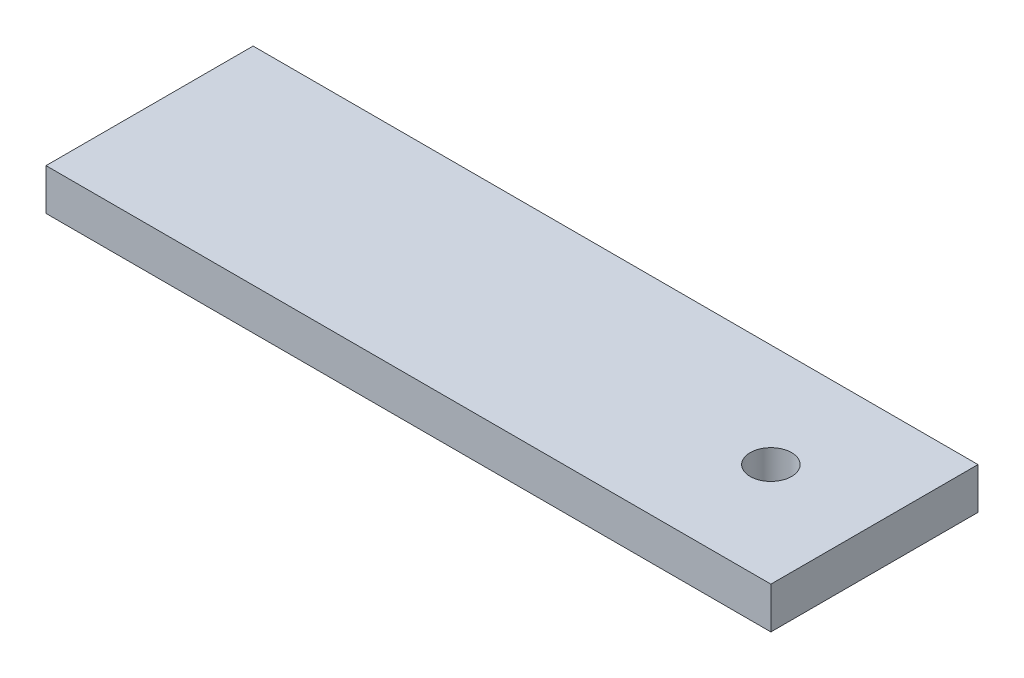
ISO-10303-21;
HEADER;
FILE_DESCRIPTION(('STEP AP214'),'2;1');
FILE_NAME('part.step','',(''),(''),'','','');
FILE_SCHEMA(('AUTOMOTIVE_DESIGN { 1 0 10303 214 1 1 1 1 }'));
ENDSEC;
DATA;
#1=APPLICATION_CONTEXT('core data for automotive mechanical design processes');
#2=APPLICATION_PROTOCOL_DEFINITION('international standard','automotive_design',2000,#1);
#3=PRODUCT_CONTEXT('',#1,'mechanical');
#4=PRODUCT('Part','Part','',(#3));
#5=PRODUCT_RELATED_PRODUCT_CATEGORY('part','',(#4));
#6=PRODUCT_DEFINITION_FORMATION('','',#4);
#7=PRODUCT_DEFINITION_CONTEXT('part definition',#1,'design');
#8=PRODUCT_DEFINITION('design','',#6,#7);
#9=PRODUCT_DEFINITION_SHAPE('','',#8);
#10=(LENGTH_UNIT() NAMED_UNIT(*) SI_UNIT(.MILLI.,.METRE.));
#11=(NAMED_UNIT(*) PLANE_ANGLE_UNIT() SI_UNIT($,.RADIAN.));
#12=(NAMED_UNIT(*) SI_UNIT($,.STERADIAN.) SOLID_ANGLE_UNIT());
#13=UNCERTAINTY_MEASURE_WITH_UNIT(LENGTH_MEASURE(1.E-05),#10,'distance_accuracy_value','');
#14=(GEOMETRIC_REPRESENTATION_CONTEXT(3) GLOBAL_UNCERTAINTY_ASSIGNED_CONTEXT((#13)) GLOBAL_UNIT_ASSIGNED_CONTEXT((#10,
#11,#12)) REPRESENTATION_CONTEXT('',''));
#15=CARTESIAN_POINT('',(0.,0.,0.));
#16=DIRECTION('',(0.,0.,1.));
#17=DIRECTION('',(1.,0.,0.));
#18=AXIS2_PLACEMENT_3D('',#15,#16,#17);
#19=CARTESIAN_POINT('',(0.,4.,0.));
#20=DIRECTION('',(1.,0.,0.));
#21=DIRECTION('',(0.,0.,-1.));
#22=AXIS2_PLACEMENT_3D('',#19,#20,#21);
#23=PLANE('',#22);
#24=DIRECTION('',(0.,0.,1.));
#25=VECTOR('',#24,1.);
#26=CARTESIAN_POINT('',(0.,0.,0.));
#27=LINE('',#26,#25);
#28=CARTESIAN_POINT('',(0.,0.,-20.));
#29=VERTEX_POINT('',#28);
#30=CARTESIAN_POINT('',(0.,0.,0.));
#31=VERTEX_POINT('',#30);
#32=EDGE_CURVE('E96',#29,#31,#27,.T.);
#33=ORIENTED_EDGE('',*,*,#32,.T.);
#34=DIRECTION('',(0.,-1.,0.));
#35=VECTOR('',#34,1.);
#36=CARTESIAN_POINT('',(0.,4.,0.));
#37=LINE('',#36,#35);
#38=CARTESIAN_POINT('',(0.,4.,0.));
#39=VERTEX_POINT('',#38);
#40=EDGE_CURVE('E11',#39,#31,#37,.T.);
#41=ORIENTED_EDGE('',*,*,#40,.F.);
#42=DIRECTION('',(0.,0.,1.));
#43=VECTOR('',#42,1.);
#44=CARTESIAN_POINT('',(0.,4.,0.));
#45=LINE('',#44,#43);
#46=CARTESIAN_POINT('',(0.,4.,-20.));
#47=VERTEX_POINT('',#46);
#48=EDGE_CURVE('E84',#47,#39,#45,.T.);
#49=ORIENTED_EDGE('',*,*,#48,.F.);
#50=DIRECTION('',(0.,-1.,0.));
#51=VECTOR('',#50,1.);
#52=CARTESIAN_POINT('',(0.,4.,-20.));
#53=LINE('',#52,#51);
#54=EDGE_CURVE('E92',#47,#29,#53,.T.);
#55=ORIENTED_EDGE('',*,*,#54,.T.);
#56=EDGE_LOOP('',(#33,#41,#49,#55));
#57=FACE_BOUND('',#56,.T.);
#58=ADVANCED_FACE('F33',(#57),#23,.F.);
#59=CARTESIAN_POINT('',(0.,4.,0.));
#60=DIRECTION('',(0.,0.,-1.));
#61=DIRECTION('',(-1.,0.,0.));
#62=AXIS2_PLACEMENT_3D('',#59,#60,#61);
#63=PLANE('',#62);
#64=DIRECTION('',(1.,0.,0.));
#65=VECTOR('',#64,1.);
#66=CARTESIAN_POINT('',(0.,0.,0.));
#67=LINE('',#66,#65);
#68=CARTESIAN_POINT('',(70.,0.,0.));
#69=VERTEX_POINT('',#68);
#70=EDGE_CURVE('E88',#31,#69,#67,.T.);
#71=ORIENTED_EDGE('',*,*,#70,.T.);
#72=DIRECTION('',(0.,-1.,0.));
#73=VECTOR('',#72,1.);
#74=CARTESIAN_POINT('',(70.,4.,0.));
#75=LINE('',#74,#73);
#76=CARTESIAN_POINT('',(70.,4.,0.));
#77=VERTEX_POINT('',#76);
#78=EDGE_CURVE('E41',#77,#69,#75,.T.);
#79=ORIENTED_EDGE('',*,*,#78,.F.);
#80=DIRECTION('',(1.,0.,0.));
#81=VECTOR('',#80,1.);
#82=CARTESIAN_POINT('',(0.,4.,0.));
#83=LINE('',#82,#81);
#84=EDGE_CURVE('E79',#39,#77,#83,.T.);
#85=ORIENTED_EDGE('',*,*,#84,.F.);
#86=ORIENTED_EDGE('',*,*,#40,.T.);
#87=EDGE_LOOP('',(#71,#79,#85,#86));
#88=FACE_BOUND('',#87,.T.);
#89=ADVANCED_FACE('F87',(#88),#63,.F.);
#90=CARTESIAN_POINT('',(70.,4.,0.));
#91=DIRECTION('',(-1.,0.,0.));
#92=DIRECTION('',(0.,0.,1.));
#93=AXIS2_PLACEMENT_3D('',#90,#91,#92);
#94=PLANE('',#93);
#95=DIRECTION('',(0.,0.,-1.));
#96=VECTOR('',#95,1.);
#97=CARTESIAN_POINT('',(70.,0.,0.));
#98=LINE('',#97,#96);
#99=CARTESIAN_POINT('',(70.,0.,-20.));
#100=VERTEX_POINT('',#99);
#101=EDGE_CURVE('E66',#69,#100,#98,.T.);
#102=ORIENTED_EDGE('',*,*,#101,.T.);
#103=DIRECTION('',(0.,-1.,0.));
#104=VECTOR('',#103,1.);
#105=CARTESIAN_POINT('',(70.,4.,-20.));
#106=LINE('',#105,#104);
#107=CARTESIAN_POINT('',(70.,4.,-20.));
#108=VERTEX_POINT('',#107);
#109=EDGE_CURVE('E89',#108,#100,#106,.T.);
#110=ORIENTED_EDGE('',*,*,#109,.F.);
#111=DIRECTION('',(0.,0.,-1.));
#112=VECTOR('',#111,1.);
#113=CARTESIAN_POINT('',(70.,4.,0.));
#114=LINE('',#113,#112);
#115=EDGE_CURVE('E82',#77,#108,#114,.T.);
#116=ORIENTED_EDGE('',*,*,#115,.F.);
#117=ORIENTED_EDGE('',*,*,#78,.T.);
#118=EDGE_LOOP('',(#102,#110,#116,#117));
#119=FACE_BOUND('',#118,.T.);
#120=ADVANCED_FACE('F90',(#119),#94,.F.);
#121=CARTESIAN_POINT('',(0.,4.,-20.));
#122=DIRECTION('',(0.,0.,1.));
#123=DIRECTION('',(1.,0.,0.));
#124=AXIS2_PLACEMENT_3D('',#121,#122,#123);
#125=PLANE('',#124);
#126=DIRECTION('',(-1.,0.,0.));
#127=VECTOR('',#126,1.);
#128=CARTESIAN_POINT('',(0.,0.,-20.));
#129=LINE('',#128,#127);
#130=EDGE_CURVE('E72',#100,#29,#129,.T.);
#131=ORIENTED_EDGE('',*,*,#130,.T.);
#132=ORIENTED_EDGE('',*,*,#54,.F.);
#133=DIRECTION('',(-1.,0.,0.));
#134=VECTOR('',#133,1.);
#135=CARTESIAN_POINT('',(0.,4.,-20.));
#136=LINE('',#135,#134);
#137=EDGE_CURVE('E49',#108,#47,#136,.T.);
#138=ORIENTED_EDGE('',*,*,#137,.F.);
#139=ORIENTED_EDGE('',*,*,#109,.T.);
#140=EDGE_LOOP('',(#131,#132,#138,#139));
#141=FACE_BOUND('',#140,.T.);
#142=ADVANCED_FACE('F104',(#141),#125,.F.);
#143=CARTESIAN_POINT('',(0.,4.,0.));
#144=DIRECTION('',(0.,-1.,0.));
#145=DIRECTION('',(0.,0.,-1.));
#146=AXIS2_PLACEMENT_3D('',#143,#144,#145);
#147=PLANE('',#146);
#148=CARTESIAN_POINT('',(60.,4.,-10.));
#149=DIRECTION('',(0.,1.,0.));
#150=DIRECTION('',(0.,0.,1.));
#151=AXIS2_PLACEMENT_3D('',#148,#149,#150);
#152=CIRCLE('',#151,2.);
#153=CARTESIAN_POINT('',(60.,4.,-8.));
#154=VERTEX_POINT('',#153);
#155=EDGE_CURVE('E110',#154,#154,#152,.T.);
#156=ORIENTED_EDGE('',*,*,#155,.F.);
#157=EDGE_LOOP('',(#156));
#158=FACE_BOUND('',#157,.T.);
#159=ORIENTED_EDGE('',*,*,#48,.T.);
#160=ORIENTED_EDGE('',*,*,#84,.T.);
#161=ORIENTED_EDGE('',*,*,#115,.T.);
#162=ORIENTED_EDGE('',*,*,#137,.T.);
#163=EDGE_LOOP('',(#159,#160,#161,#162));
#164=FACE_BOUND('',#163,.T.);
#165=ADVANCED_FACE('F80',(#158,#164),#147,.F.);
#166=CARTESIAN_POINT('',(0.,0.,0.));
#167=DIRECTION('',(0.,-1.,0.));
#168=DIRECTION('',(0.,0.,-1.));
#169=AXIS2_PLACEMENT_3D('',#166,#167,#168);
#170=PLANE('',#169);
#171=CARTESIAN_POINT('',(60.,0.,-10.));
#172=DIRECTION('',(0.,1.,0.));
#173=DIRECTION('',(0.,0.,1.));
#174=AXIS2_PLACEMENT_3D('',#171,#172,#173);
#175=CIRCLE('',#174,2.);
#176=CARTESIAN_POINT('',(60.,0.,-8.));
#177=VERTEX_POINT('',#176);
#178=EDGE_CURVE('E99',#177,#177,#175,.T.);
#179=ORIENTED_EDGE('',*,*,#178,.T.);
#180=EDGE_LOOP('',(#179));
#181=FACE_BOUND('',#180,.T.);
#182=ORIENTED_EDGE('',*,*,#32,.F.);
#183=ORIENTED_EDGE('',*,*,#130,.F.);
#184=ORIENTED_EDGE('',*,*,#101,.F.);
#185=ORIENTED_EDGE('',*,*,#70,.F.);
#186=EDGE_LOOP('',(#182,#183,#184,#185));
#187=FACE_BOUND('',#186,.T.);
#188=ADVANCED_FACE('F107',(#181,#187),#170,.T.);
#189=CARTESIAN_POINT('',(60.,0.,-10.));
#190=DIRECTION('',(0.,1.,0.));
#191=DIRECTION('',(0.,0.,1.));
#192=AXIS2_PLACEMENT_3D('',#189,#190,#191);
#193=CYLINDRICAL_SURFACE('',#192,2.);
#194=ORIENTED_EDGE('',*,*,#178,.F.);
#195=EDGE_LOOP('',(#194));
#196=FACE_BOUND('',#195,.T.);
#197=ORIENTED_EDGE('',*,*,#155,.T.);
#198=EDGE_LOOP('',(#197));
#199=FACE_BOUND('',#198,.T.);
#200=ADVANCED_FACE('F117',(#196,#199),#193,.F.);
#201=CLOSED_SHELL('',(#58,#89,#120,#142,#165,#188,#200));
#202=MANIFOLD_SOLID_BREP('B2',#201);
#203=ADVANCED_BREP_SHAPE_REPRESENTATION('',(#18,#202),#14);
#204=SHAPE_DEFINITION_REPRESENTATION(#9,#203);
ENDSEC;
END-ISO-10303-21;
